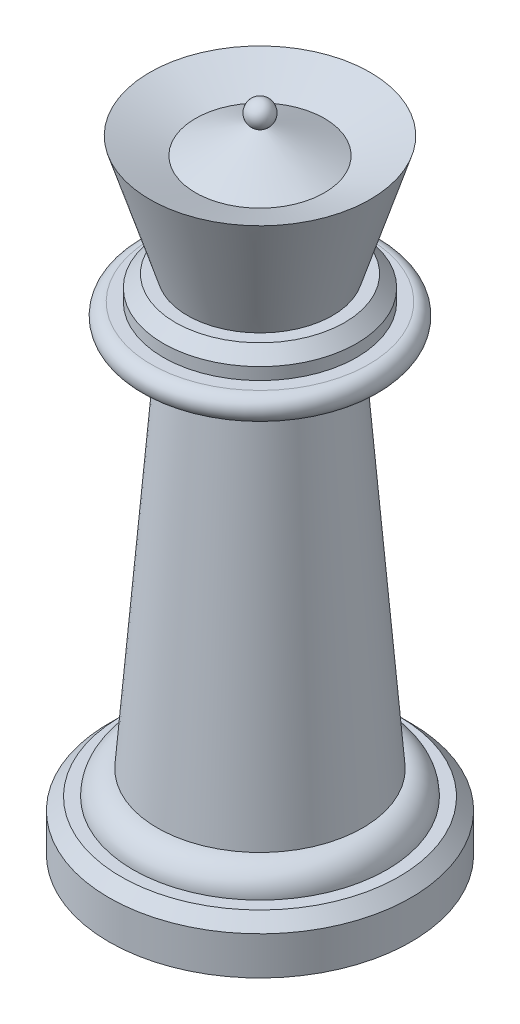
ISO-10303-21;
HEADER;
FILE_DESCRIPTION(('STEP AP214'),'2;1');
FILE_NAME('part.step','',(''),(''),'','','');
FILE_SCHEMA(('AUTOMOTIVE_DESIGN { 1 0 10303 214 1 1 1 1 }'));
ENDSEC;
DATA;
#1=APPLICATION_CONTEXT('core data for automotive mechanical design processes');
#2=APPLICATION_PROTOCOL_DEFINITION('international standard','automotive_design',2000,#1);
#3=PRODUCT_CONTEXT('',#1,'mechanical');
#4=PRODUCT('Part','Part','',(#3));
#5=PRODUCT_RELATED_PRODUCT_CATEGORY('part','',(#4));
#6=PRODUCT_DEFINITION_FORMATION('','',#4);
#7=PRODUCT_DEFINITION_CONTEXT('part definition',#1,'design');
#8=PRODUCT_DEFINITION('design','',#6,#7);
#9=PRODUCT_DEFINITION_SHAPE('','',#8);
#10=(LENGTH_UNIT() NAMED_UNIT(*) SI_UNIT(.MILLI.,.METRE.));
#11=(NAMED_UNIT(*) PLANE_ANGLE_UNIT() SI_UNIT($,.RADIAN.));
#12=(NAMED_UNIT(*) SI_UNIT($,.STERADIAN.) SOLID_ANGLE_UNIT());
#13=UNCERTAINTY_MEASURE_WITH_UNIT(LENGTH_MEASURE(1.E-05),#10,'distance_accuracy_value','');
#14=(GEOMETRIC_REPRESENTATION_CONTEXT(3) GLOBAL_UNCERTAINTY_ASSIGNED_CONTEXT((#13)) GLOBAL_UNIT_ASSIGNED_CONTEXT((#10,
#11,#12)) REPRESENTATION_CONTEXT('',''));
#15=CARTESIAN_POINT('',(0.,0.,0.));
#16=DIRECTION('',(0.,0.,1.));
#17=DIRECTION('',(1.,0.,0.));
#18=AXIS2_PLACEMENT_3D('',#15,#16,#17);
#19=CARTESIAN_POINT('',(0.,0.,0.));
#20=DIRECTION('',(0.,1.,0.));
#21=DIRECTION('',(0.,0.,1.));
#22=AXIS2_PLACEMENT_3D('',#19,#20,#21);
#23=PLANE('',#22);
#24=CARTESIAN_POINT('',(0.,0.,0.));
#25=DIRECTION('',(0.,-1.,0.));
#26=DIRECTION('',(0.,0.,-1.));
#27=AXIS2_PLACEMENT_3D('',#24,#25,#26);
#28=CIRCLE('',#27,9.525);
#29=CARTESIAN_POINT('',(0.,0.,-9.525));
#30=VERTEX_POINT('',#29);
#31=EDGE_CURVE('E89',#30,#30,#28,.T.);
#32=ORIENTED_EDGE('',*,*,#31,.T.);
#33=EDGE_LOOP('',(#32));
#34=FACE_BOUND('',#33,.T.);
#35=ADVANCED_FACE('F38',(#34),#23,.F.);
#36=CARTESIAN_POINT('',(0.,40.513,0.));
#37=DIRECTION('',(0.,-1.,0.));
#38=DIRECTION('',(-1.,0.,0.));
#39=AXIS2_PLACEMENT_3D('',#36,#37,#38);
#40=SPHERICAL_SURFACE('',#39,0.761999999999999);
#41=CARTESIAN_POINT('',(0.,39.8518731212378,0.));
#42=DIRECTION('',(0.,-1.,0.));
#43=DIRECTION('',(0.,0.,-1.));
#44=AXIS2_PLACEMENT_3D('',#41,#42,#43);
#45=CIRCLE('',#44,0.378886856697502);
#46=CARTESIAN_POINT('',(0.,39.8518731212378,-0.378886856697495));
#47=VERTEX_POINT('',#46);
#48=EDGE_CURVE('E59',#47,#47,#45,.T.);
#49=ORIENTED_EDGE('',*,*,#48,.F.);
#50=EDGE_LOOP('',(#49));
#51=FACE_BOUND('',#50,.T.);
#52=ADVANCED_FACE('F111',(#51),#40,.T.);
#53=CARTESIAN_POINT('',(0.,39.8518731212378,0.));
#54=DIRECTION('',(0.,-1.,0.));
#55=DIRECTION('',(0.,0.,-1.));
#56=AXIS2_PLACEMENT_3D('',#53,#54,#55);
#57=CONICAL_SURFACE('',#56,0.378886856697502,1.14466578861794);
#58=CARTESIAN_POINT('',(0.,38.1790309038726,0.));
#59=DIRECTION('',(0.,-1.,0.));
#60=DIRECTION('',(0.,0.,-1.));
#61=AXIS2_PLACEMENT_3D('',#58,#59,#60);
#62=CIRCLE('',#61,4.06400000000001);
#63=CARTESIAN_POINT('',(0.,38.1790309038726,-4.064));
#64=VERTEX_POINT('',#63);
#65=EDGE_CURVE('E62',#64,#64,#62,.T.);
#66=CARTESIAN_POINT('',(0.,38.1790309038726,-4.064));
#67=CARTESIAN_POINT('',(0.,38.1964563436368,-4.02561340475727));
#68=CARTESIAN_POINT('',(0.,38.213881783401,-3.98722680951453));
#69=CARTESIAN_POINT('',(0.,38.2487326629295,-3.91045361902906));
#70=CARTESIAN_POINT('',(0.,38.2661581026937,-3.87206702378633));
#71=CARTESIAN_POINT('',(0.,38.3010089822221,-3.79529383330086));
#72=CARTESIAN_POINT('',(0.,38.3184344219864,-3.75690723805813));
#73=CARTESIAN_POINT('',(0.,38.3532853015148,-3.68013404757266));
#74=CARTESIAN_POINT('',(0.,38.370710741279,-3.64174745232992));
#75=CARTESIAN_POINT('',(0.,38.4055616208075,-3.56497426184445));
#76=CARTESIAN_POINT('',(0.,38.4229870605717,-3.52658766660172));
#77=CARTESIAN_POINT('',(0.,38.4578379401001,-3.44981447611625));
#78=CARTESIAN_POINT('',(0.,38.4752633798644,-3.41142788087352));
#79=CARTESIAN_POINT('',(0.,38.5101142593928,-3.33465469038805));
#80=CARTESIAN_POINT('',(0.,38.527539699157,-3.29626809514531));
#81=CARTESIAN_POINT('',(0.,38.5623905786855,-3.21949490465984));
#82=CARTESIAN_POINT('',(0.,38.5798160184497,-3.18110830941711));
#83=CARTESIAN_POINT('',(0.,38.6146668979781,-3.10433511893164));
#84=CARTESIAN_POINT('',(0.,38.6320923377423,-3.0659485236889));
#85=CARTESIAN_POINT('',(0.,38.6669432172708,-2.98917533320344));
#86=CARTESIAN_POINT('',(0.,38.684368657035,-2.9507887379607));
#87=CARTESIAN_POINT('',(0.,38.7192195365634,-2.87401554747523));
#88=CARTESIAN_POINT('',(0.,38.7366449763277,-2.8356289522325));
#89=CARTESIAN_POINT('',(0.,38.7714958558561,-2.75885576174703));
#90=CARTESIAN_POINT('',(0.,38.7889212956203,-2.7204691665043));
#91=CARTESIAN_POINT('',(0.,38.8237721751488,-2.64369597601883));
#92=CARTESIAN_POINT('',(0.,38.841197614913,-2.60530938077609));
#93=CARTESIAN_POINT('',(0.,38.8760484944414,-2.52853619029062));
#94=CARTESIAN_POINT('',(0.,38.8934739342057,-2.49014959504789));
#95=CARTESIAN_POINT('',(0.,38.9283248137341,-2.41337640456242));
#96=CARTESIAN_POINT('',(0.,38.9457502534983,-2.37498980931969));
#97=CARTESIAN_POINT('',(0.,38.9806011330267,-2.29821661883422));
#98=CARTESIAN_POINT('',(0.,38.998026572791,-2.25983002359148));
#99=CARTESIAN_POINT('',(0.,39.0328774523194,-2.18305683310601));
#100=CARTESIAN_POINT('',(0.,39.0503028920836,-2.14467023786328));
#101=CARTESIAN_POINT('',(0.,39.0851537716121,-2.06789704737781));
#102=CARTESIAN_POINT('',(0.,39.1025792113763,-2.02951045213507));
#103=CARTESIAN_POINT('',(0.,39.1374300909047,-1.95273726164961));
#104=CARTESIAN_POINT('',(0.,39.154855530669,-1.91435066640687));
#105=CARTESIAN_POINT('',(0.,39.1897064101974,-1.8375774759214));
#106=CARTESIAN_POINT('',(0.,39.2071318499616,-1.79919088067867));
#107=CARTESIAN_POINT('',(0.,39.2419827294901,-1.7224176901932));
#108=CARTESIAN_POINT('',(0.,39.2594081692543,-1.68403109495047));
#109=CARTESIAN_POINT('',(0.,39.2942590487827,-1.607257904465));
#110=CARTESIAN_POINT('',(0.,39.3116844885469,-1.56887130922226));
#111=CARTESIAN_POINT('',(0.,39.3465353680754,-1.49209811873679));
#112=CARTESIAN_POINT('',(0.,39.3639608078396,-1.45371152349406));
#113=CARTESIAN_POINT('',(0.,39.398811687368,-1.37693833300859));
#114=CARTESIAN_POINT('',(0.,39.4162371271323,-1.33855173776586));
#115=CARTESIAN_POINT('',(0.,39.4510880066607,-1.26177854728039));
#116=CARTESIAN_POINT('',(0.,39.4685134464249,-1.22339195203765));
#117=CARTESIAN_POINT('',(0.,39.5033643259534,-1.14661876155218));
#118=CARTESIAN_POINT('',(0.,39.5207897657176,-1.10823216630945));
#119=CARTESIAN_POINT('',(0.,39.555640645246,-1.03145897582398));
#120=CARTESIAN_POINT('',(0.,39.5730660850102,-0.993072380581245));
#121=CARTESIAN_POINT('',(0.,39.6079169645387,-0.916299190095776));
#122=CARTESIAN_POINT('',(0.,39.6253424043029,-0.877912594853043));
#123=CARTESIAN_POINT('',(0.,39.6601932838313,-0.801139404367574));
#124=CARTESIAN_POINT('',(0.,39.6776187235956,-0.762752809124839));
#125=CARTESIAN_POINT('',(0.,39.712469603124,-0.68597961863937));
#126=CARTESIAN_POINT('',(0.,39.7298950428882,-0.647593023396636));
#127=CARTESIAN_POINT('',(0.,39.7647459224167,-0.570819832911167));
#128=CARTESIAN_POINT('',(0.,39.7821713621809,-0.532433237668432));
#129=CARTESIAN_POINT('',(0.,39.8170222417093,-0.455660047182963));
#130=CARTESIAN_POINT('',(0.,39.8344476814736,-0.417273451940228));
#131=CARTESIAN_POINT('',(0.,39.8518731212378,-0.378886856697495));
#132=B_SPLINE_CURVE_WITH_KNOTS('',3,(#66,#67,#68,#69,#70,#71,#72,#73,#74,#75,#76,#77,#78,#79,
#80,#81,#82,#83,#84,#85,#86,#87,#88,#89,#90,#91,#92,#93,#94,#95,#96,#97,#98,#99,#100,#101,#102,
#103,#104,#105,#106,#107,#108,#109,#110,#111,#112,#113,#114,#115,#116,#117,#118,#119,#120,#121,
#122,#123,#124,#125,#126,#127,#128,#129,#130,#131),.UNSPECIFIED.,.F.,.F.,(4,2,2,2,2,2,2,2,2,2,2,
2,2,2,2,2,2,2,2,2,2,2,2,2,2,2,2,2,2,2,2,2,4),(0.,0.126469718936011,0.252939437872023,
0.379409156808037,0.505878875744048,0.632348594680062,0.758818313616074,0.885288032552088,
1.0117577514881,1.13822747042411,1.26469718936012,1.39116690829614,1.51763662723215,
1.64410634616816,1.77057606510418,1.89704578404019,2.0235155029762,2.14998522191221,
2.27645494084822,2.40292465978424,2.52939437872025,2.65586409765626,2.78233381659228,
2.90880353552829,3.0352732544643,3.16174297340031,3.28821269233633,3.41468241127234,
3.54115213020835,3.66762184914436,3.79409156808038,3.92056128701639,4.0470310059524),.UNSPECIFIED.);
#133=EDGE_CURVE('BSEAM116',#64,#47,#132,.T.);
#134=ORIENTED_EDGE('',*,*,#65,.F.);
#135=ORIENTED_EDGE('',*,*,#48,.T.);
#136=ORIENTED_EDGE('',*,*,#133,.T.);
#137=ORIENTED_EDGE('',*,*,#133,.F.);
#138=EDGE_LOOP('',(#134,#136,#135,#137));
#139=FACE_BOUND('',#138,.T.);
#140=ADVANCED_FACE('F116',(#139),#57,.T.);
#141=CARTESIAN_POINT('',(0.,38.1790309038726,0.));
#142=DIRECTION('',(0.,1.,0.));
#143=DIRECTION('',(0.,0.,1.));
#144=AXIS2_PLACEMENT_3D('',#141,#142,#143);
#145=CONICAL_SURFACE('',#144,4.06400000000001,1.21375917489139);
#146=CARTESIAN_POINT('',(0.,39.2543812972836,0.));
#147=DIRECTION('',(0.,-1.,0.));
#148=DIRECTION('',(0.,0.,-1.));
#149=AXIS2_PLACEMENT_3D('',#146,#147,#148);
#150=CIRCLE('',#149,6.94679152947641);
#151=CARTESIAN_POINT('',(0.,39.2543812972836,-6.94679152947641));
#152=VERTEX_POINT('',#151);
#153=EDGE_CURVE('E65',#152,#152,#150,.T.);
#154=ORIENTED_EDGE('',*,*,#153,.F.);
#155=EDGE_LOOP('',(#154));
#156=FACE_BOUND('',#155,.T.);
#157=ORIENTED_EDGE('',*,*,#65,.T.);
#158=EDGE_LOOP('',(#157));
#159=FACE_BOUND('',#158,.T.);
#160=ADVANCED_FACE('F236',(#156,#159),#145,.F.);
#161=CARTESIAN_POINT('',(0.,39.2543812972836,0.));
#162=DIRECTION('',(0.,1.,0.));
#163=DIRECTION('',(0.,0.,1.));
#164=AXIS2_PLACEMENT_3D('',#161,#162,#163);
#165=CONICAL_SURFACE('',#164,6.94679152947641,0.305512416394749);
#166=CARTESIAN_POINT('',(0.,31.7246,0.));
#167=DIRECTION('',(0.,-1.,0.));
#168=DIRECTION('',(0.,0.,-1.));
#169=AXIS2_PLACEMENT_3D('',#166,#167,#168);
#170=CIRCLE('',#169,4.572);
#171=CARTESIAN_POINT('',(0.,31.7246,-4.572));
#172=VERTEX_POINT('',#171);
#173=EDGE_CURVE('E68',#172,#172,#170,.T.);
#174=ORIENTED_EDGE('',*,*,#173,.F.);
#175=EDGE_LOOP('',(#174));
#176=FACE_BOUND('',#175,.T.);
#177=ORIENTED_EDGE('',*,*,#153,.T.);
#178=EDGE_LOOP('',(#177));
#179=FACE_BOUND('',#178,.T.);
#180=ADVANCED_FACE('F162',(#176,#179),#165,.T.);
#181=CARTESIAN_POINT('',(-6.096,31.7246,0.));
#182=DIRECTION('',(0.,-1.,0.));
#183=DIRECTION('',(0.,0.,-1.));
#184=AXIS2_PLACEMENT_3D('',#181,#182,#183);
#185=PLANE('',#184);
#186=CARTESIAN_POINT('',(0.,31.7246,0.));
#187=DIRECTION('',(0.,-1.,0.));
#188=DIRECTION('',(0.,0.,-1.));
#189=AXIS2_PLACEMENT_3D('',#186,#187,#188);
#190=CIRCLE('',#189,5.334);
#191=CARTESIAN_POINT('',(0.,31.7246,-5.334));
#192=VERTEX_POINT('',#191);
#193=EDGE_CURVE('E10',#192,#192,#190,.F.);
#194=ORIENTED_EDGE('',*,*,#193,.T.);
#195=EDGE_LOOP('',(#194));
#196=FACE_BOUND('',#195,.T.);
#197=ORIENTED_EDGE('',*,*,#173,.T.);
#198=EDGE_LOOP('',(#197));
#199=FACE_BOUND('',#198,.T.);
#200=ADVANCED_FACE('F151',(#196,#199),#185,.F.);
#201=CARTESIAN_POINT('',(0.,0.,0.));
#202=DIRECTION('',(0.,-1.,0.));
#203=DIRECTION('',(0.,0.,-1.));
#204=AXIS2_PLACEMENT_3D('',#201,#202,#203);
#205=CYLINDRICAL_SURFACE('',#204,6.096);
#206=CARTESIAN_POINT('',(0.,30.9626,0.));
#207=DIRECTION('',(0.,-1.,0.));
#208=DIRECTION('',(0.,0.,-1.));
#209=AXIS2_PLACEMENT_3D('',#206,#207,#208);
#210=CIRCLE('',#209,6.096);
#211=CARTESIAN_POINT('',(0.,30.9626,-6.096));
#212=VERTEX_POINT('',#211);
#213=EDGE_CURVE('E46',#212,#212,#210,.T.);
#214=ORIENTED_EDGE('',*,*,#213,.T.);
#215=EDGE_LOOP('',(#214));
#216=FACE_BOUND('',#215,.T.);
#217=CARTESIAN_POINT('',(0.,30.2006,0.));
#218=DIRECTION('',(0.,-1.,0.));
#219=DIRECTION('',(0.,0.,-1.));
#220=AXIS2_PLACEMENT_3D('',#217,#218,#219);
#221=CIRCLE('',#220,6.096);
#222=CARTESIAN_POINT('',(0.,30.2006,-6.096));
#223=VERTEX_POINT('',#222);
#224=EDGE_CURVE('E71',#223,#223,#221,.T.);
#225=ORIENTED_EDGE('',*,*,#224,.F.);
#226=EDGE_LOOP('',(#225));
#227=FACE_BOUND('',#226,.T.);
#228=ADVANCED_FACE('F145',(#216,#227),#205,.T.);
#229=CARTESIAN_POINT('',(-6.858,30.2006,0.));
#230=DIRECTION('',(0.,-1.,0.));
#231=DIRECTION('',(0.,0.,-1.));
#232=AXIS2_PLACEMENT_3D('',#229,#230,#231);
#233=PLANE('',#232);
#234=CARTESIAN_POINT('',(0.,30.2006,0.));
#235=DIRECTION('',(0.,-1.,0.));
#236=DIRECTION('',(0.,0.,-1.));
#237=AXIS2_PLACEMENT_3D('',#234,#235,#236);
#238=CIRCLE('',#237,6.858);
#239=CARTESIAN_POINT('',(0.,30.2006,-6.858));
#240=VERTEX_POINT('',#239);
#241=EDGE_CURVE('E74',#240,#240,#238,.T.);
#242=ORIENTED_EDGE('',*,*,#241,.F.);
#243=EDGE_LOOP('',(#242));
#244=FACE_BOUND('',#243,.T.);
#245=ORIENTED_EDGE('',*,*,#224,.T.);
#246=EDGE_LOOP('',(#245));
#247=FACE_BOUND('',#246,.T.);
#248=ADVANCED_FACE('F150',(#244,#247),#233,.F.);
#249=CARTESIAN_POINT('',(0.,29.4386,0.));
#250=DIRECTION('',(0.,-1.,0.));
#251=DIRECTION('',(0.,0.,-1.));
#252=AXIS2_PLACEMENT_3D('',#249,#250,#251);
#253=TOROIDAL_SURFACE('',#252,6.858,0.761999999999999);
#254=CARTESIAN_POINT('',(0.,28.6766,0.));
#255=DIRECTION('',(0.,-1.,0.));
#256=DIRECTION('',(0.,0.,-1.));
#257=AXIS2_PLACEMENT_3D('',#254,#255,#256);
#258=CIRCLE('',#257,6.858);
#259=CARTESIAN_POINT('',(0.,28.6766,-6.858));
#260=VERTEX_POINT('',#259);
#261=EDGE_CURVE('E77',#260,#260,#258,.T.);
#262=ORIENTED_EDGE('',*,*,#261,.F.);
#263=EDGE_LOOP('',(#262));
#264=FACE_BOUND('',#263,.T.);
#265=ORIENTED_EDGE('',*,*,#241,.T.);
#266=EDGE_LOOP('',(#265));
#267=FACE_BOUND('',#266,.T.);
#268=ADVANCED_FACE('F209',(#264,#267),#253,.T.);
#269=CARTESIAN_POINT('',(-4.572,28.6766,0.));
#270=DIRECTION('',(0.,1.,0.));
#271=DIRECTION('',(0.,0.,1.));
#272=AXIS2_PLACEMENT_3D('',#269,#270,#271);
#273=PLANE('',#272);
#274=CARTESIAN_POINT('',(0.,28.6766,0.));
#275=DIRECTION('',(0.,-1.,0.));
#276=DIRECTION('',(0.,0.,-1.));
#277=AXIS2_PLACEMENT_3D('',#274,#275,#276);
#278=CIRCLE('',#277,4.572);
#279=CARTESIAN_POINT('',(0.,28.6766,-4.572));
#280=VERTEX_POINT('',#279);
#281=EDGE_CURVE('E80',#280,#280,#278,.T.);
#282=ORIENTED_EDGE('',*,*,#281,.F.);
#283=EDGE_LOOP('',(#282));
#284=FACE_BOUND('',#283,.T.);
#285=ORIENTED_EDGE('',*,*,#261,.T.);
#286=EDGE_LOOP('',(#285));
#287=FACE_BOUND('',#286,.T.);
#288=ADVANCED_FACE('F198',(#284,#287),#273,.F.);
#289=CARTESIAN_POINT('',(0.,28.6766,0.));
#290=DIRECTION('',(0.,-1.,0.));
#291=DIRECTION('',(0.,0.,-1.));
#292=AXIS2_PLACEMENT_3D('',#289,#290,#291);
#293=CONICAL_SURFACE('',#292,4.572,0.0792826173458509);
#294=CARTESIAN_POINT('',(0.,4.699,0.));
#295=DIRECTION('',(0.,-1.,0.));
#296=DIRECTION('',(0.,0.,-1.));
#297=AXIS2_PLACEMENT_3D('',#294,#295,#296);
#298=CIRCLE('',#297,6.477);
#299=CARTESIAN_POINT('',(0.,4.699,-6.477));
#300=VERTEX_POINT('',#299);
#301=EDGE_CURVE('E83',#300,#300,#298,.T.);
#302=ORIENTED_EDGE('',*,*,#301,.F.);
#303=EDGE_LOOP('',(#302));
#304=FACE_BOUND('',#303,.T.);
#305=ORIENTED_EDGE('',*,*,#281,.T.);
#306=EDGE_LOOP('',(#305));
#307=FACE_BOUND('',#306,.T.);
#308=ADVANCED_FACE('F107',(#304,#307),#293,.T.);
#309=CARTESIAN_POINT('',(-9.525,3.175,0.));
#310=DIRECTION('',(0.,-1.,0.));
#311=DIRECTION('',(0.,0.,-1.));
#312=AXIS2_PLACEMENT_3D('',#309,#310,#311);
#313=PLANE('',#312);
#314=CARTESIAN_POINT('',(0.,3.175,0.));
#315=DIRECTION('',(0.,-1.,0.));
#316=DIRECTION('',(0.,0.,-1.));
#317=AXIS2_PLACEMENT_3D('',#314,#315,#316);
#318=CIRCLE('',#317,8.763);
#319=CARTESIAN_POINT('',(0.,3.175,-8.763));
#320=VERTEX_POINT('',#319);
#321=EDGE_CURVE('E50',#320,#320,#318,.F.);
#322=ORIENTED_EDGE('',*,*,#321,.T.);
#323=EDGE_LOOP('',(#322));
#324=FACE_BOUND('',#323,.T.);
#325=CARTESIAN_POINT('',(0.,3.175,0.));
#326=DIRECTION('',(0.,-1.,0.));
#327=DIRECTION('',(0.,0.,-1.));
#328=AXIS2_PLACEMENT_3D('',#325,#326,#327);
#329=CIRCLE('',#328,8.001);
#330=CARTESIAN_POINT('',(0.,3.175,-8.001));
#331=VERTEX_POINT('',#330);
#332=EDGE_CURVE('E86',#331,#331,#329,.T.);
#333=ORIENTED_EDGE('',*,*,#332,.T.);
#334=EDGE_LOOP('',(#333));
#335=FACE_BOUND('',#334,.T.);
#336=ADVANCED_FACE('F97',(#324,#335),#313,.F.);
#337=CARTESIAN_POINT('',(0.,0.,0.));
#338=DIRECTION('',(0.,-1.,0.));
#339=DIRECTION('',(0.,0.,-1.));
#340=AXIS2_PLACEMENT_3D('',#337,#338,#339);
#341=CYLINDRICAL_SURFACE('',#340,9.525);
#342=CARTESIAN_POINT('',(0.,2.413,0.));
#343=DIRECTION('',(0.,-1.,0.));
#344=DIRECTION('',(0.,0.,-1.));
#345=AXIS2_PLACEMENT_3D('',#342,#343,#344);
#346=CIRCLE('',#345,9.525);
#347=CARTESIAN_POINT('',(0.,2.413,-9.525));
#348=VERTEX_POINT('',#347);
#349=EDGE_CURVE('E54',#348,#348,#346,.T.);
#350=ORIENTED_EDGE('',*,*,#349,.T.);
#351=EDGE_LOOP('',(#350));
#352=FACE_BOUND('',#351,.T.);
#353=ORIENTED_EDGE('',*,*,#31,.F.);
#354=EDGE_LOOP('',(#353));
#355=FACE_BOUND('',#354,.T.);
#356=ADVANCED_FACE('F94',(#352,#355),#341,.T.);
#357=CARTESIAN_POINT('',(0.,3.175,0.));
#358=DIRECTION('',(0.,-1.,0.));
#359=DIRECTION('',(0.,0.,-1.));
#360=AXIS2_PLACEMENT_3D('',#357,#358,#359);
#361=TOROIDAL_SURFACE('',#360,6.477,1.524);
#362=ORIENTED_EDGE('',*,*,#301,.T.);
#363=EDGE_LOOP('',(#362));
#364=FACE_BOUND('',#363,.T.);
#365=ORIENTED_EDGE('',*,*,#332,.F.);
#366=EDGE_LOOP('',(#365));
#367=FACE_BOUND('',#366,.T.);
#368=ADVANCED_FACE('F96',(#364,#367),#361,.T.);
#369=CARTESIAN_POINT('',(0.,2.413,0.));
#370=DIRECTION('',(0.,-1.,0.));
#371=DIRECTION('',(0.,0.,-1.));
#372=AXIS2_PLACEMENT_3D('',#369,#370,#371);
#373=CONICAL_SURFACE('',#372,9.525,0.785398163397451);
#374=ORIENTED_EDGE('',*,*,#321,.F.);
#375=EDGE_LOOP('',(#374));
#376=FACE_BOUND('',#375,.T.);
#377=ORIENTED_EDGE('',*,*,#349,.F.);
#378=EDGE_LOOP('',(#377));
#379=FACE_BOUND('',#378,.T.);
#380=ADVANCED_FACE('F104',(#376,#379),#373,.T.);
#381=CARTESIAN_POINT('',(0.,30.9626,0.));
#382=DIRECTION('',(0.,-1.,0.));
#383=DIRECTION('',(0.,0.,-1.));
#384=AXIS2_PLACEMENT_3D('',#381,#382,#383);
#385=CONICAL_SURFACE('',#384,6.096,0.785398163397449);
#386=ORIENTED_EDGE('',*,*,#193,.F.);
#387=EDGE_LOOP('',(#386));
#388=FACE_BOUND('',#387,.T.);
#389=ORIENTED_EDGE('',*,*,#213,.F.);
#390=EDGE_LOOP('',(#389));
#391=FACE_BOUND('',#390,.T.);
#392=ADVANCED_FACE('F41',(#388,#391),#385,.T.);
#393=CLOSED_SHELL('',(#35,#52,#140,#160,#180,#200,#228,#248,#268,#288,#308,#336,#356,#368,#380,#392));
#394=MANIFOLD_SOLID_BREP('B2',#393);
#395=ADVANCED_BREP_SHAPE_REPRESENTATION('',(#18,#394),#14);
#396=SHAPE_DEFINITION_REPRESENTATION(#9,#395);
ENDSEC;
END-ISO-10303-21;
